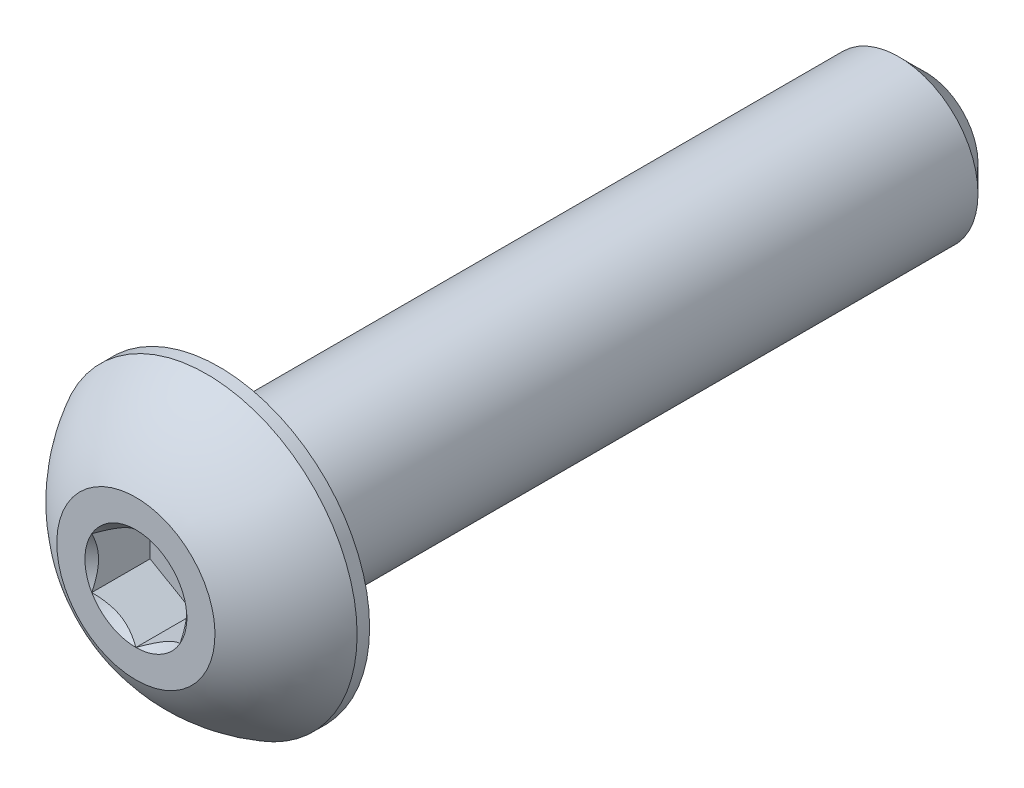
ISO-10303-21;
HEADER;
FILE_DESCRIPTION(('STEP AP214'),'2;1');
FILE_NAME('part.step','',(''),(''),'','','');
FILE_SCHEMA(('AUTOMOTIVE_DESIGN { 1 0 10303 214 1 1 1 1 }'));
ENDSEC;
DATA;
#1=APPLICATION_CONTEXT('core data for automotive mechanical design processes');
#2=APPLICATION_PROTOCOL_DEFINITION('international standard','automotive_design',2000,#1);
#3=PRODUCT_CONTEXT('',#1,'mechanical');
#4=PRODUCT('Part','Part','',(#3));
#5=PRODUCT_RELATED_PRODUCT_CATEGORY('part','',(#4));
#6=PRODUCT_DEFINITION_FORMATION('','',#4);
#7=PRODUCT_DEFINITION_CONTEXT('part definition',#1,'design');
#8=PRODUCT_DEFINITION('design','',#6,#7);
#9=PRODUCT_DEFINITION_SHAPE('','',#8);
#10=(LENGTH_UNIT() NAMED_UNIT(*) SI_UNIT(.MILLI.,.METRE.));
#11=(NAMED_UNIT(*) PLANE_ANGLE_UNIT() SI_UNIT($,.RADIAN.));
#12=(NAMED_UNIT(*) SI_UNIT($,.STERADIAN.) SOLID_ANGLE_UNIT());
#13=UNCERTAINTY_MEASURE_WITH_UNIT(LENGTH_MEASURE(1.E-05),#10,'distance_accuracy_value','');
#14=(GEOMETRIC_REPRESENTATION_CONTEXT(3) GLOBAL_UNCERTAINTY_ASSIGNED_CONTEXT((#13)) GLOBAL_UNIT_ASSIGNED_CONTEXT((#10,
#11,#12)) REPRESENTATION_CONTEXT('',''));
#15=CARTESIAN_POINT('',(0.,0.,0.));
#16=DIRECTION('',(0.,0.,1.));
#17=DIRECTION('',(1.,0.,0.));
#18=AXIS2_PLACEMENT_3D('',#15,#16,#17);
#19=CARTESIAN_POINT('',(0.,-1.4224,-14.1986));
#20=DIRECTION('',(0.,0.,-1.));
#21=DIRECTION('',(0.,1.,0.));
#22=AXIS2_PLACEMENT_3D('',#19,#20,#21);
#23=PLANE('',#22);
#24=CARTESIAN_POINT('',(0.,0.,-14.1986));
#25=DIRECTION('',(0.,0.,-1.));
#26=DIRECTION('',(0.,1.,0.));
#27=AXIS2_PLACEMENT_3D('',#24,#25,#26);
#28=CIRCLE('',#27,0.946150000000001);
#29=CARTESIAN_POINT('',(0.,-0.94615,-14.1986));
#30=VERTEX_POINT('',#29);
#31=EDGE_CURVE('E198',#30,#30,#28,.T.);
#32=ORIENTED_EDGE('',*,*,#31,.T.);
#33=EDGE_LOOP('',(#32));
#34=FACE_BOUND('',#33,.T.);
#35=ADVANCED_FACE('F39',(#34),#23,.T.);
#36=CARTESIAN_POINT('',(0.,0.,-14.1986));
#37=DIRECTION('',(0.,0.,-1.));
#38=DIRECTION('',(0.,1.,0.));
#39=AXIS2_PLACEMENT_3D('',#36,#37,#38);
#40=CYLINDRICAL_SURFACE('',#39,1.4224);
#41=CARTESIAN_POINT('',(0.,0.,-13.72235));
#42=DIRECTION('',(0.,0.,-1.));
#43=DIRECTION('',(0.,1.,0.));
#44=AXIS2_PLACEMENT_3D('',#41,#42,#43);
#45=CIRCLE('',#44,1.4224);
#46=CARTESIAN_POINT('',(0.,-1.4224,-13.72235));
#47=VERTEX_POINT('',#46);
#48=EDGE_CURVE('E54',#47,#47,#45,.F.);
#49=ORIENTED_EDGE('',*,*,#48,.T.);
#50=EDGE_LOOP('',(#49));
#51=FACE_BOUND('',#50,.T.);
#52=CARTESIAN_POINT('',(0.,0.,-1.4986));
#53=DIRECTION('',(0.,0.,1.));
#54=DIRECTION('',(1.,0.,0.));
#55=AXIS2_PLACEMENT_3D('',#52,#53,#54);
#56=CIRCLE('',#55,1.4224);
#57=CARTESIAN_POINT('',(1.4224,0.,-1.4986));
#58=VERTEX_POINT('',#57);
#59=EDGE_CURVE('E194',#58,#58,#56,.F.);
#60=ORIENTED_EDGE('',*,*,#59,.T.);
#61=EDGE_LOOP('',(#60));
#62=FACE_BOUND('',#61,.T.);
#63=ADVANCED_FACE('F206',(#51,#62),#40,.T.);
#64=CARTESIAN_POINT('',(0.,0.,-14.1986));
#65=DIRECTION('',(0.,0.,1.));
#66=DIRECTION('',(0.,-1.,0.));
#67=AXIS2_PLACEMENT_3D('',#64,#65,#66);
#68=CONICAL_SURFACE('',#67,0.946150000000001,0.785398163397447);
#69=CARTESIAN_POINT('',(0.,-1.4224,-13.72235));
#70=CARTESIAN_POINT('',(0.,-1.4174390625,-13.7273109375));
#71=CARTESIAN_POINT('',(0.,-1.412478125,-13.732271875));
#72=CARTESIAN_POINT('',(0.,-1.40255625,-13.74219375));
#73=CARTESIAN_POINT('',(0.,-1.3975953125,-13.7471546875));
#74=CARTESIAN_POINT('',(0.,-1.3876734375,-13.7570765625));
#75=CARTESIAN_POINT('',(0.,-1.3827125,-13.7620375));
#76=CARTESIAN_POINT('',(0.,-1.372790625,-13.771959375));
#77=CARTESIAN_POINT('',(0.,-1.3678296875,-13.7769203125));
#78=CARTESIAN_POINT('',(0.,-1.3579078125,-13.7868421875));
#79=CARTESIAN_POINT('',(0.,-1.352946875,-13.791803125));
#80=CARTESIAN_POINT('',(0.,-1.343025,-13.801725));
#81=CARTESIAN_POINT('',(0.,-1.3380640625,-13.8066859375));
#82=CARTESIAN_POINT('',(0.,-1.3281421875,-13.8166078125));
#83=CARTESIAN_POINT('',(0.,-1.32318125,-13.82156875));
#84=CARTESIAN_POINT('',(0.,-1.313259375,-13.831490625));
#85=CARTESIAN_POINT('',(0.,-1.3082984375,-13.8364515625));
#86=CARTESIAN_POINT('',(0.,-1.2983765625,-13.8463734375));
#87=CARTESIAN_POINT('',(0.,-1.293415625,-13.851334375));
#88=CARTESIAN_POINT('',(0.,-1.28349375,-13.86125625));
#89=CARTESIAN_POINT('',(0.,-1.2785328125,-13.8662171875));
#90=CARTESIAN_POINT('',(0.,-1.2686109375,-13.8761390625));
#91=CARTESIAN_POINT('',(0.,-1.26365,-13.8811));
#92=CARTESIAN_POINT('',(0.,-1.253728125,-13.891021875));
#93=CARTESIAN_POINT('',(0.,-1.2487671875,-13.8959828125));
#94=CARTESIAN_POINT('',(0.,-1.2388453125,-13.9059046875));
#95=CARTESIAN_POINT('',(0.,-1.233884375,-13.910865625));
#96=CARTESIAN_POINT('',(0.,-1.2239625,-13.9207875));
#97=CARTESIAN_POINT('',(0.,-1.2190015625,-13.9257484375));
#98=CARTESIAN_POINT('',(0.,-1.2090796875,-13.9356703125));
#99=CARTESIAN_POINT('',(0.,-1.20411875,-13.94063125));
#100=CARTESIAN_POINT('',(0.,-1.194196875,-13.950553125));
#101=CARTESIAN_POINT('',(0.,-1.1892359375,-13.9555140625));
#102=CARTESIAN_POINT('',(0.,-1.1793140625,-13.9654359375));
#103=CARTESIAN_POINT('',(0.,-1.174353125,-13.970396875));
#104=CARTESIAN_POINT('',(0.,-1.16443125,-13.98031875));
#105=CARTESIAN_POINT('',(0.,-1.1594703125,-13.9852796875));
#106=CARTESIAN_POINT('',(0.,-1.1495484375,-13.9952015625));
#107=CARTESIAN_POINT('',(0.,-1.1445875,-14.0001625));
#108=CARTESIAN_POINT('',(0.,-1.134665625,-14.010084375));
#109=CARTESIAN_POINT('',(0.,-1.1297046875,-14.0150453125));
#110=CARTESIAN_POINT('',(0.,-1.1197828125,-14.0249671875));
#111=CARTESIAN_POINT('',(0.,-1.114821875,-14.029928125));
#112=CARTESIAN_POINT('',(0.,-1.1049,-14.03985));
#113=CARTESIAN_POINT('',(0.,-1.0999390625,-14.0448109375));
#114=CARTESIAN_POINT('',(0.,-1.0900171875,-14.0547328125));
#115=CARTESIAN_POINT('',(0.,-1.08505625,-14.05969375));
#116=CARTESIAN_POINT('',(0.,-1.075134375,-14.069615625));
#117=CARTESIAN_POINT('',(0.,-1.0701734375,-14.0745765625));
#118=CARTESIAN_POINT('',(0.,-1.0602515625,-14.0844984375));
#119=CARTESIAN_POINT('',(0.,-1.055290625,-14.089459375));
#120=CARTESIAN_POINT('',(0.,-1.04536875,-14.09938125));
#121=CARTESIAN_POINT('',(0.,-1.0404078125,-14.1043421875));
#122=CARTESIAN_POINT('',(0.,-1.0304859375,-14.1142640625));
#123=CARTESIAN_POINT('',(0.,-1.025525,-14.119225));
#124=CARTESIAN_POINT('',(0.,-1.015603125,-14.129146875));
#125=CARTESIAN_POINT('',(0.,-1.0106421875,-14.1341078125));
#126=CARTESIAN_POINT('',(0.,-1.0007203125,-14.1440296875));
#127=CARTESIAN_POINT('',(0.,-0.995759375,-14.148990625));
#128=CARTESIAN_POINT('',(0.,-0.9858375,-14.1589125));
#129=CARTESIAN_POINT('',(0.,-0.9808765625,-14.1638734375));
#130=CARTESIAN_POINT('',(0.,-0.9709546875,-14.1737953125));
#131=CARTESIAN_POINT('',(0.,-0.96599375,-14.17875625));
#132=CARTESIAN_POINT('',(0.,-0.956071875,-14.188678125));
#133=CARTESIAN_POINT('',(0.,-0.9511109375,-14.1936390625));
#134=CARTESIAN_POINT('',(0.,-0.94615,-14.1986));
#135=B_SPLINE_CURVE_WITH_KNOTS('',3,(#69,#70,#71,#72,#73,#74,#75,#76,#77,#78,#79,#80,#81,#82,
#83,#84,#85,#86,#87,#88,#89,#90,#91,#92,#93,#94,#95,#96,#97,#98,#99,#100,#101,#102,#103,#104,
#105,#106,#107,#108,#109,#110,#111,#112,#113,#114,#115,#116,#117,#118,#119,#120,#121,#122,#123,
#124,#125,#126,#127,#128,#129,#130,#131,#132,#133,#134),.UNSPECIFIED.,.F.,.F.,(4,2,2,2,2,2,2,2,
2,2,2,2,2,2,2,2,2,2,2,2,2,2,2,2,2,2,2,2,2,2,2,2,4),(0.,0.0210474752837548,0.0420949505675108,
0.063142425851267,0.084189901135023,0.105237376418779,0.126284851702534,0.14733232698629,
0.168379802270046,0.189427277553802,0.210474752837558,0.231522228121313,0.252569703405069,
0.273617178688825,0.294664653972581,0.315712129256337,0.336759604540094,0.357807079823848,
0.378854555107605,0.399902030391361,0.420949505675117,0.441996980958873,0.463044456242628,
0.484091931526384,0.50513940681014,0.526186882093896,0.547234357377652,0.568281832661407,
0.589329307945163,0.610376783228919,0.631424258512675,0.652471733796431,0.673519209080186),.UNSPECIFIED.);
#136=EDGE_CURVE('BSEAM41',#47,#30,#135,.T.);
#137=ORIENTED_EDGE('',*,*,#48,.F.);
#138=ORIENTED_EDGE('',*,*,#31,.F.);
#139=ORIENTED_EDGE('',*,*,#136,.T.);
#140=ORIENTED_EDGE('',*,*,#136,.F.);
#141=EDGE_LOOP('',(#137,#139,#138,#140));
#142=FACE_BOUND('',#141,.T.);
#143=ADVANCED_FACE('F41',(#142),#68,.T.);
#144=CARTESIAN_POINT('',(0.,0.,-2.71505804087737));
#145=DIRECTION('',(0.,0.,1.));
#146=DIRECTION('',(0.,-1.,0.));
#147=AXIS2_PLACEMENT_3D('',#144,#145,#146);
#148=SPHERICAL_SURFACE('',#147,3.06508758852546);
#149=CARTESIAN_POINT('',(0.,0.,0.));
#150=DIRECTION('',(0.,0.,1.));
#151=DIRECTION('',(1.,0.,0.));
#152=AXIS2_PLACEMENT_3D('',#149,#150,#151);
#153=CIRCLE('',#152,1.4224);
#154=CARTESIAN_POINT('',(0.,-1.4224,0.));
#155=VERTEX_POINT('',#154);
#156=EDGE_CURVE('E190',#155,#155,#153,.T.);
#157=CARTESIAN_POINT('',(0.,0.,-1.27381));
#158=DIRECTION('',(0.,0.,1.));
#159=DIRECTION('',(1.,0.,0.));
#160=AXIS2_PLACEMENT_3D('',#157,#158,#159);
#161=CIRCLE('',#160,2.7051);
#162=CARTESIAN_POINT('',(0.,-2.7051,-1.27381));
#163=VERTEX_POINT('',#162);
#164=EDGE_CURVE('E182',#163,#163,#161,.T.);
#165=CARTESIAN_POINT('',(0.,-1.4224,0.));
#166=CARTESIAN_POINT('',(0.,-1.43933190212973,-0.00887048024317412));
#167=CARTESIAN_POINT('',(0.,-1.45618080460607,-0.0178993875420682));
#168=CARTESIAN_POINT('',(0.,-1.48970676037734,-0.036270809458289));
#169=CARTESIAN_POINT('',(0.,-1.50638381367226,-0.0456133240756156));
#170=CARTESIAN_POINT('',(0.,-1.53956022120603,-0.0646087138356938));
#171=CARTESIAN_POINT('',(0.,-1.55605957544488,-0.0742615889784453));
#172=CARTESIAN_POINT('',(0.,-1.58887481330553,-0.0938743149547814));
#173=CARTESIAN_POINT('',(0.,-1.60519069692734,-0.103834165788366));
#174=CARTESIAN_POINT('',(0.,-1.63763328189127,-0.124057358747556));
#175=CARTESIAN_POINT('',(0.,-1.6537599832334,-0.134320700873162));
#176=CARTESIAN_POINT('',(0.,-1.68581855934851,-0.155147283680413));
#177=CARTESIAN_POINT('',(0.,-1.70175043412149,-0.165710524362057));
#178=CARTESIAN_POINT('',(0.,-1.73341378069034,-0.187133207143222));
#179=CARTESIAN_POINT('',(0.,-1.74914525248621,-0.197992649242742));
#180=CARTESIAN_POINT('',(0.,-1.78040228691937,-0.220003933895924));
#181=CARTESIAN_POINT('',(0.,-1.79592784955665,-0.231155776449586));
#182=CARTESIAN_POINT('',(0.,-1.82676763153947,-0.253747958744367));
#183=CARTESIAN_POINT('',(0.,-1.84208185088501,-0.265188298485486));
#184=CARTESIAN_POINT('',(0.,-1.87249358612982,-0.288353470900217));
#185=CARTESIAN_POINT('',(0.,-1.88759110202907,-0.300078303573831));
#186=CARTESIAN_POINT('',(0.,-1.91756414607389,-0.323808358025657));
#187=CARTESIAN_POINT('',(0.,-1.93243967421946,-0.33581357980387));
#188=CARTESIAN_POINT('',(0.,-1.96196353614822,-0.360100210496753));
#189=CARTESIAN_POINT('',(0.,-1.97661186993141,-0.372381619411424));
#190=CARTESIAN_POINT('',(0.,-2.00567621604733,-0.397216325740561));
#191=CARTESIAN_POINT('',(0.,-2.02009222838005,-0.409769623155029));
#192=CARTESIAN_POINT('',(0.,-2.04868688582218,-0.435143712682892));
#193=CARTESIAN_POINT('',(0.,-2.06286553093158,-0.447964504796288));
#194=CARTESIAN_POINT('',(0.,-2.09098049123551,-0.473869096294883));
#195=CARTESIAN_POINT('',(0.,-2.10491680643004,-0.486952895680081));
#196=CARTESIAN_POINT('',(0.,-2.13254222903097,-0.51337892223953));
#197=CARTESIAN_POINT('',(0.,-2.14623133643737,-0.52672114941378));
#198=CARTESIAN_POINT('',(0.,-2.17335755211441,-0.553659361615835));
#199=CARTESIAN_POINT('',(0.,-2.18679466038506,-0.567255346643641));
#200=CARTESIAN_POINT('',(0.,-2.21341217464559,-0.594696315799095));
#201=CARTESIAN_POINT('',(0.,-2.22659258063549,-0.608541299926743));
#202=CARTESIAN_POINT('',(0.,-2.25269207703834,-0.636475421375575));
#203=CARTESIAN_POINT('',(0.,-2.2656111674513,-0.650564558696759));
#204=CARTESIAN_POINT('',(0.,-2.29118351086759,-0.678982055169879));
#205=CARTESIAN_POINT('',(0.,-2.30383676387093,-0.693310414321815));
#206=CARTESIAN_POINT('',(0.,-2.32887300368148,-0.722201339363229));
#207=CARTESIAN_POINT('',(0.,-2.34125599048871,-0.736763905252708));
#208=CARTESIAN_POINT('',(0.,-2.36574736371693,-0.766118146700866));
#209=CARTESIAN_POINT('',(0.,-2.37785575013793,-0.780909822259547));
#210=CARTESIAN_POINT('',(0.,-2.40179368451673,-0.810717105786825));
#211=CARTESIAN_POINT('',(0.,-2.41362323247454,-0.825732713755422));
#212=CARTESIAN_POINT('',(0.,-2.43699934944748,-0.855982606463854));
#213=CARTESIAN_POINT('',(0.,-2.44854591846261,-0.871216891203689));
#214=CARTESIAN_POINT('',(0.,-2.47135203611378,-0.901898805278105));
#215=CARTESIAN_POINT('',(0.,-2.48261158474981,-0.917346434612687));
#216=CARTESIAN_POINT('',(0.,-2.50483972067765,-0.948449631020968));
#217=CARTESIAN_POINT('',(0.,-2.51580830796946,-0.964105198094666));
#218=CARTESIAN_POINT('',(0.,-2.53745068204317,-0.995618790367452));
#219=CARTESIAN_POINT('',(0.,-2.54812446882507,-1.01147681556654));
#220=CARTESIAN_POINT('',(0.,-2.56917350604789,-1.04338977352953));
#221=CARTESIAN_POINT('',(0.,-2.57954875648881,-1.05944470629344));
#222=CARTESIAN_POINT('',(0.,-2.59999708912621,-1.09174586021953));
#223=CARTESIAN_POINT('',(0.,-2.61007017132268,-1.10799208138171));
#224=CARTESIAN_POINT('',(0.,-2.62991064343366,-1.14067012481285));
#225=CARTESIAN_POINT('',(0.,-2.63967803334818,-1.15710194708181));
#226=CARTESIAN_POINT('',(0.,-2.65890369600298,-1.19014544484563));
#227=CARTESIAN_POINT('',(0.,-2.66836196874327,-1.2067571203405));
#228=CARTESIAN_POINT('',(0.,-2.68696610965097,-1.24015449740349));
#229=CARTESIAN_POINT('',(0.,-2.69611197781837,-1.2569401989716));
#230=CARTESIAN_POINT('',(0.,-2.7051,-1.27381));
#231=B_SPLINE_CURVE_WITH_KNOTS('',3,(#165,#166,#167,#168,#169,#170,#171,#172,#173,#174,#175,
#176,#177,#178,#179,#180,#181,#182,#183,#184,#185,#186,#187,#188,#189,#190,#191,#192,#193,#194,
#195,#196,#197,#198,#199,#200,#201,#202,#203,#204,#205,#206,#207,#208,#209,#210,#211,#212,#213,
#214,#215,#216,#217,#218,#219,#220,#221,#222,#223,#224,#225,#226,#227,#228,#229,#230),
.UNSPECIFIED.,.F.,.F.,(4,2,2,2,2,2,2,2,2,2,2,2,2,2,2,2,2,2,2,2,2,2,2,2,2,2,2,2,2,2,2,2,4),(0.,
0.0573434957892615,0.114686991578524,0.172030487367785,0.229373983157046,0.286717478946308,
0.344060974735569,0.401404470524831,0.458747966314093,0.516091462103354,0.573434957892616,
0.630778453681877,0.688121949471139,0.7454654452604,0.802808941049662,0.860152436838924,
0.917495932628186,0.974839428417447,1.03218292420671,1.08952641999597,1.14686991578523,
1.20421341157449,1.26155690736375,1.31890040315302,1.37624389894228,1.43358739473154,
1.4909308905208,1.54827438631006,1.60561788209932,1.66296137788859,1.72030487367785,
1.77764836946711,1.83499186525637),.UNSPECIFIED.);
#232=EDGE_CURVE('BSEAM211',#155,#163,#231,.T.);
#233=ORIENTED_EDGE('',*,*,#156,.F.);
#234=ORIENTED_EDGE('',*,*,#164,.T.);
#235=ORIENTED_EDGE('',*,*,#232,.T.);
#236=ORIENTED_EDGE('',*,*,#232,.F.);
#237=EDGE_LOOP('',(#233,#235,#234,#236));
#238=FACE_BOUND('',#237,.T.);
#239=ADVANCED_FACE('F211',(#238),#148,.T.);
#240=CARTESIAN_POINT('',(0.,-1.4224,0.));
#241=DIRECTION('',(0.,0.,-1.));
#242=DIRECTION('',(-1.,0.,0.));
#243=AXIS2_PLACEMENT_3D('',#240,#241,#242);
#244=PLANE('',#243);
#245=CARTESIAN_POINT('',(0.,0.,0.));
#246=DIRECTION('',(0.,0.,1.));
#247=DIRECTION('',(1.,0.,0.));
#248=AXIS2_PLACEMENT_3D('',#245,#246,#247);
#249=CIRCLE('',#248,0.91654355233853);
#250=CARTESIAN_POINT('',(-0.793749999999999,0.458271776169265,0.));
#251=VERTEX_POINT('',#250);
#252=CARTESIAN_POINT('',(-0.793749999999999,-0.458271776169265,0.));
#253=VERTEX_POINT('',#252);
#254=EDGE_CURVE('E67',#251,#253,#249,.T.);
#255=ORIENTED_EDGE('',*,*,#254,.F.);
#256=CARTESIAN_POINT('',(0.,0.91654355233853,0.));
#257=VERTEX_POINT('',#256);
#258=EDGE_CURVE('E146',#257,#251,#249,.T.);
#259=ORIENTED_EDGE('',*,*,#258,.F.);
#260=CARTESIAN_POINT('',(0.79375,0.458271776169264,0.));
#261=VERTEX_POINT('',#260);
#262=EDGE_CURVE('E139',#261,#257,#249,.T.);
#263=ORIENTED_EDGE('',*,*,#262,.F.);
#264=CARTESIAN_POINT('',(0.79375,-0.458271776169264,0.));
#265=VERTEX_POINT('',#264);
#266=EDGE_CURVE('E108',#265,#261,#249,.T.);
#267=ORIENTED_EDGE('',*,*,#266,.F.);
#268=CARTESIAN_POINT('',(0.,-0.91654355233853,0.));
#269=VERTEX_POINT('',#268);
#270=EDGE_CURVE('E99',#269,#265,#249,.T.);
#271=ORIENTED_EDGE('',*,*,#270,.F.);
#272=EDGE_CURVE('E60',#253,#269,#249,.T.);
#273=ORIENTED_EDGE('',*,*,#272,.F.);
#274=EDGE_LOOP('',(#255,#259,#263,#267,#271,#273));
#275=FACE_BOUND('',#274,.T.);
#276=ORIENTED_EDGE('',*,*,#156,.T.);
#277=EDGE_LOOP('',(#276));
#278=FACE_BOUND('',#277,.T.);
#279=ADVANCED_FACE('F136',(#275,#278),#244,.F.);
#280=CARTESIAN_POINT('',(0.,-2.7051,-1.4986));
#281=DIRECTION('',(0.,0.,1.));
#282=DIRECTION('',(1.,0.,0.));
#283=AXIS2_PLACEMENT_3D('',#280,#281,#282);
#284=PLANE('',#283);
#285=ORIENTED_EDGE('',*,*,#59,.F.);
#286=EDGE_LOOP('',(#285));
#287=FACE_BOUND('',#286,.T.);
#288=CARTESIAN_POINT('',(0.,0.,-1.4986));
#289=DIRECTION('',(0.,0.,1.));
#290=DIRECTION('',(1.,0.,0.));
#291=AXIS2_PLACEMENT_3D('',#288,#289,#290);
#292=CIRCLE('',#291,2.7051);
#293=CARTESIAN_POINT('',(2.7051,0.,-1.4986));
#294=VERTEX_POINT('',#293);
#295=EDGE_CURVE('E186',#294,#294,#292,.T.);
#296=ORIENTED_EDGE('',*,*,#295,.F.);
#297=EDGE_LOOP('',(#296));
#298=FACE_BOUND('',#297,.T.);
#299=ADVANCED_FACE('F225',(#287,#298),#284,.F.);
#300=CARTESIAN_POINT('',(0.,0.,0.));
#301=DIRECTION('',(0.,0.,1.));
#302=DIRECTION('',(1.,0.,0.));
#303=AXIS2_PLACEMENT_3D('',#300,#301,#302);
#304=CYLINDRICAL_SURFACE('',#303,2.7051);
#305=ORIENTED_EDGE('',*,*,#164,.F.);
#306=EDGE_LOOP('',(#305));
#307=FACE_BOUND('',#306,.T.);
#308=ORIENTED_EDGE('',*,*,#295,.T.);
#309=EDGE_LOOP('',(#308));
#310=FACE_BOUND('',#309,.T.);
#311=ADVANCED_FACE('F228',(#307,#310),#304,.T.);
#312=CARTESIAN_POINT('',(0.,0.,0.));
#313=DIRECTION('',(0.,0.,1.));
#314=DIRECTION('',(1.,0.,0.));
#315=AXIS2_PLACEMENT_3D('',#312,#313,#314);
#316=CONICAL_SURFACE('',#315,0.91654355233853,0.78539816339745);
#317=ORIENTED_EDGE('',*,*,#266,.T.);
#318=CARTESIAN_POINT('',(0.79375,-0.913980968764267,0.293993631627029));
#319=CARTESIAN_POINT('',(0.79375,-0.891726118538055,0.277193311496454));
#320=CARTESIAN_POINT('',(0.79375,-0.869347264877752,0.260557718257382));
#321=CARTESIAN_POINT('',(0.79375,-0.824291243045378,0.227684030234418));
#322=CARTESIAN_POINT('',(0.79375,-0.801614001904386,0.211446035566629));
#323=CARTESIAN_POINT('',(0.79375,-0.732727209979177,0.163198806065011));
#324=CARTESIAN_POINT('',(0.79375,-0.686000956762751,0.131915081801585));
#325=CARTESIAN_POINT('',(0.79375,-0.588017825073374,0.0705014022532252));
#326=CARTESIAN_POINT('',(0.79375,-0.536654577597366,0.040539224828267));
#327=CARTESIAN_POINT('',(0.79375,-0.431362595405614,-0.0142679836015005));
#328=CARTESIAN_POINT('',(0.79375,-0.377443295160548,-0.0391302653555209));
#329=CARTESIAN_POINT('',(0.79375,-0.29650995625636,-0.0695469630114991));
#330=CARTESIAN_POINT('',(0.79375,-0.270694141900047,-0.0782767741549606));
#331=CARTESIAN_POINT('',(0.79375,-0.218439268973956,-0.0936638158775335));
#332=CARTESIAN_POINT('',(0.79375,-0.192000167603285,-0.100320903674906));
#333=CARTESIAN_POINT('',(0.79375,-0.139102716934156,-0.1111049811602));
#334=CARTESIAN_POINT('',(0.79375,-0.112653420679399,-0.115275685244172));
#335=CARTESIAN_POINT('',(0.79375,-0.0594633329666475,-0.121008229605795));
#336=CARTESIAN_POINT('',(0.79375,-0.0327224976765033,-0.122569671987743));
#337=CARTESIAN_POINT('',(0.79375,0.0198050550771914,-0.122965171893322));
#338=CARTESIAN_POINT('',(0.79375,0.0455910742996345,-0.121896431038318));
#339=CARTESIAN_POINT('',(0.79375,0.0969445862525452,-0.117304647495367));
#340=CARTESIAN_POINT('',(0.79375,0.122512036164618,-0.113781134579862));
#341=CARTESIAN_POINT('',(0.79375,0.173672423354303,-0.104412391955399));
#342=CARTESIAN_POINT('',(0.79375,0.199258034653238,-0.0985277583090937));
#343=CARTESIAN_POINT('',(0.79375,0.249870222697891,-0.084749526681036));
#344=CARTESIAN_POINT('',(0.79375,0.274896846029654,-0.0768560967969795));
#345=CARTESIAN_POINT('',(0.79375,0.353690387196626,-0.0490351109532734));
#346=CARTESIAN_POINT('',(0.79375,0.406335817043669,-0.0259390687874084));
#347=CARTESIAN_POINT('',(0.79375,0.50915351257115,0.0254121679018188));
#348=CARTESIAN_POINT('',(0.79375,0.559316042936871,0.0536858976787298));
#349=CARTESIAN_POINT('',(0.79375,0.655183863923379,0.112017096551381));
#350=CARTESIAN_POINT('',(0.79375,0.700986777162507,0.141916107892194));
#351=CARTESIAN_POINT('',(0.79375,0.768468152386361,0.188136889360364));
#352=CARTESIAN_POINT('',(0.79375,0.790670702494181,0.203706789966175));
#353=CARTESIAN_POINT('',(0.79375,0.834772410478896,0.235258385232157));
#354=CARTESIAN_POINT('',(0.79375,0.856671649663555,0.251239966115284));
#355=CARTESIAN_POINT('',(0.79375,0.878444595919578,0.267392244316132));
#356=B_SPLINE_CURVE_WITH_KNOTS('',3,(#318,#319,#320,#321,#322,#323,#324,#325,#326,#327,#328,
#329,#330,#331,#332,#333,#334,#335,#336,#337,#338,#339,#340,#341,#342,#343,#344,#345,#346,#347,
#348,#349,#350,#351,#352,#353,#354,#355),.UNSPECIFIED.,.F.,.F.,(4,2,2,2,2,2,2,2,2,2,2,2,2,2,2,2,
2,2,4),(0.,0.0836505019132838,0.167321854975135,0.335941679244387,0.514186123196809,
0.691817321841748,0.773503877759004,0.855196059496702,0.935406023972398,1.01562821883824,
1.09293052036567,1.17024763372476,1.24891262607845,1.32757103784517,1.49953149859788,
1.67212003005563,1.83613214173928,1.91748242813391,1.99881046779771),.UNSPECIFIED.);
#357=EDGE_CURVE('E11',#265,#261,#356,.T.);
#358=ORIENTED_EDGE('',*,*,#357,.F.);
#359=EDGE_LOOP('',(#317,#358));
#360=FACE_BOUND('',#359,.T.);
#361=ADVANCED_FACE('F112',(#360),#316,.F.);
#362=ORIENTED_EDGE('',*,*,#262,.T.);
#363=CARTESIAN_POINT('',(0.79395,0.458156306115427,0.000115491872201689));
#364=CARTESIAN_POINT('',(0.7666563268291,0.473914315667819,-0.0156332211800419));
#365=CARTESIAN_POINT('',(0.738906237701709,0.489935837095555,-0.0304574524158215));
#366=CARTESIAN_POINT('',(0.68232025046316,0.522605772060092,-0.0576009622140622));
#367=CARTESIAN_POINT('',(0.653478963353311,0.539257296936738,-0.0699051262716212));
#368=CARTESIAN_POINT('',(0.595321679020445,0.572834420701656,-0.0909826334294039));
#369=CARTESIAN_POINT('',(0.56602051479722,0.589751455753505,-0.0998089918524525));
#370=CARTESIAN_POINT('',(0.506773157113023,0.62395793366125,-0.113408761275761));
#371=CARTESIAN_POINT('',(0.476828775638362,0.641246330366362,-0.118192331870017));
#372=CARTESIAN_POINT('',(0.425225377533547,0.671039566153276,-0.122506590544054));
#373=CARTESIAN_POINT('',(0.403633531741488,0.683505624133623,-0.123144728589032));
#374=CARTESIAN_POINT('',(0.360491632722968,0.708413611145317,-0.122073860208805));
#375=CARTESIAN_POINT('',(0.338941589763515,0.720855534249005,-0.12036433611821));
#376=CARTESIAN_POINT('',(0.274599154455217,0.758003656594567,-0.111827208841405));
#377=CARTESIAN_POINT('',(0.232126946019304,0.782524997568119,-0.101590080863207));
#378=CARTESIAN_POINT('',(0.157575609219718,0.825567231937807,-0.0768814101594512));
#379=CARTESIAN_POINT('',(0.125147212182332,0.844289775696729,-0.0637038253246891));
#380=CARTESIAN_POINT('',(0.0615608535385163,0.881001376976525,-0.0340189600483212));
#381=CARTESIAN_POINT('',(0.0303991453684829,0.898992597576902,-0.0175225121068322));
#382=CARTESIAN_POINT('',(-0.000199999999999989,0.916659022392368,0.000115491872201412));
#383=B_SPLINE_CURVE_WITH_KNOTS('',3,(#363,#364,#365,#366,#367,#368,#369,#370,#371,#372,#373,
#374,#375,#376,#377,#378,#379,#380,#381,#382),.UNSPECIFIED.,.F.,.F.,(4,2,2,2,2,2,2,2,2,4),(0.,
0.105768699105622,0.21215429718622,0.316848842533859,0.421279499712346,0.495991864977074,
0.570720707151283,0.720221070373884,0.839150369964801,0.957697614118391),.UNSPECIFIED.);
#384=EDGE_CURVE('E145',#261,#257,#383,.T.);
#385=ORIENTED_EDGE('',*,*,#384,.F.);
#386=EDGE_LOOP('',(#362,#385));
#387=FACE_BOUND('',#386,.T.);
#388=ADVANCED_FACE('F319',(#387),#316,.F.);
#389=ORIENTED_EDGE('',*,*,#258,.T.);
#390=CARTESIAN_POINT('',(0.000200000000000011,0.916659022392368,0.000115491872201451));
#391=CARTESIAN_POINT('',(-0.0270936731708998,0.900901012839975,-0.0156332211800421));
#392=CARTESIAN_POINT('',(-0.0548437622982912,0.88487949141224,-0.0304574524158218));
#393=CARTESIAN_POINT('',(-0.11142974953684,0.852209556447703,-0.0576009622140624));
#394=CARTESIAN_POINT('',(-0.140271036646688,0.835558031571057,-0.0699051262716215));
#395=CARTESIAN_POINT('',(-0.198428320979555,0.801980907806138,-0.0909826334294042));
#396=CARTESIAN_POINT('',(-0.22772948520278,0.78506387275429,-0.0998089918524528));
#397=CARTESIAN_POINT('',(-0.286976842886977,0.750857394846545,-0.113408761275762));
#398=CARTESIAN_POINT('',(-0.316921224361638,0.733568998141433,-0.118192331870018));
#399=CARTESIAN_POINT('',(-0.368524622466452,0.703775762354518,-0.122506590544054));
#400=CARTESIAN_POINT('',(-0.390116468258512,0.691309704374172,-0.123144728589032));
#401=CARTESIAN_POINT('',(-0.433258367277032,0.666401717362478,-0.122073860208806));
#402=CARTESIAN_POINT('',(-0.454808410236485,0.65395979425879,-0.12036433611821));
#403=CARTESIAN_POINT('',(-0.519150845544783,0.616811671913227,-0.111827208841406));
#404=CARTESIAN_POINT('',(-0.561623053980695,0.592290330939676,-0.101590080863207));
#405=CARTESIAN_POINT('',(-0.636174390780282,0.549248096569988,-0.0768814101594513));
#406=CARTESIAN_POINT('',(-0.668602787817667,0.530525552811065,-0.0637038253246893));
#407=CARTESIAN_POINT('',(-0.732189146461483,0.49381395153127,-0.0340189600483213));
#408=CARTESIAN_POINT('',(-0.763350854631516,0.475822730930893,-0.0175225121068323));
#409=CARTESIAN_POINT('',(-0.793949999999999,0.458156306115427,0.000115491872201152));
#410=B_SPLINE_CURVE_WITH_KNOTS('',3,(#390,#391,#392,#393,#394,#395,#396,#397,#398,#399,#400,
#401,#402,#403,#404,#405,#406,#407,#408,#409),.UNSPECIFIED.,.F.,.F.,(4,2,2,2,2,2,2,2,2,4),(0.,
0.105768699105622,0.21215429718622,0.316848842533859,0.421279499712346,0.495991864977074,
0.570720707151284,0.720221070373884,0.839150369964801,0.957697614118391),.UNSPECIFIED.);
#411=EDGE_CURVE('E153',#257,#251,#410,.T.);
#412=ORIENTED_EDGE('',*,*,#411,.F.);
#413=EDGE_LOOP('',(#389,#412));
#414=FACE_BOUND('',#413,.T.);
#415=ADVANCED_FACE('F156',(#414),#316,.F.);
#416=ORIENTED_EDGE('',*,*,#254,.T.);
#417=CARTESIAN_POINT('',(-0.793749999999999,-0.913980968631288,0.293993631526626));
#418=CARTESIAN_POINT('',(-0.793749999999999,-0.891726118408807,0.277193311399918));
#419=CARTESIAN_POINT('',(-0.793749999999999,-0.869347264752246,0.260557718164707));
#420=CARTESIAN_POINT('',(-0.793749999999999,-0.824291242927396,0.227684030149443));
#421=CARTESIAN_POINT('',(-0.793749999999999,-0.801614001790185,0.211446035485493));
#422=CARTESIAN_POINT('',(-0.793749999999999,-0.732727209876546,0.163198805995464));
#423=CARTESIAN_POINT('',(-0.793749999999999,-0.686000956667989,0.131915081739731));
#424=CARTESIAN_POINT('',(-0.793749999999999,-0.588017824995773,0.0705014022071964));
#425=CARTESIAN_POINT('',(-0.793749999999999,-0.536654577529102,0.0405392247903116));
#426=CARTESIAN_POINT('',(-0.793749999999999,-0.43136259535682,-0.0142679836244891));
#427=CARTESIAN_POINT('',(-0.793749999999999,-0.37744329512188,-0.0391302653716058));
#428=CARTESIAN_POINT('',(-0.793749999999999,-0.296509956225309,-0.0695469630224598));
#429=CARTESIAN_POINT('',(-0.793749999999999,-0.270694141865806,-0.0782767741661214));
#430=CARTESIAN_POINT('',(-0.793749999999999,-0.21843926893323,-0.0936638158884484));
#431=CARTESIAN_POINT('',(-0.793749999999999,-0.192000167559264,-0.100320903685375));
#432=CARTESIAN_POINT('',(-0.793749999999999,-0.139102716883655,-0.111104981169031));
#433=CARTESIAN_POINT('',(-0.793749999999999,-0.112653420625716,-0.11527568525183));
#434=CARTESIAN_POINT('',(-0.793749999999999,-0.0594633329067019,-0.121008229610386));
#435=CARTESIAN_POINT('',(-0.793749999999999,-0.0327224976134788,-0.122569671990441));
#436=CARTESIAN_POINT('',(-0.793749999999999,0.0198050551458938,-0.122965171891697));
#437=CARTESIAN_POINT('',(-0.793749999999999,0.0455910743709441,-0.1218964310343));
#438=CARTESIAN_POINT('',(-0.793749999999999,0.0969445863288114,-0.117304647486189));
#439=CARTESIAN_POINT('',(-0.793749999999999,0.122512036243234,-0.113781134567918));
#440=CARTESIAN_POINT('',(-0.793749999999999,0.173672423437555,-0.104412391937657));
#441=CARTESIAN_POINT('',(-0.793749999999999,0.19925803473877,-0.0985277582883018));
#442=CARTESIAN_POINT('',(-0.793749999999999,0.249870222787763,-0.0847495266540782));
#443=CARTESIAN_POINT('',(-0.793749999999999,0.274896846121587,-0.0768560967669054));
#444=CARTESIAN_POINT('',(-0.79375,0.353690387308577,-0.0490351109085087));
#445=CARTESIAN_POINT('',(-0.793749999999999,0.406335817172575,-0.0259390687291273));
#446=CARTESIAN_POINT('',(-0.793749999999999,0.509153512732664,0.0254121679886215));
#447=CARTESIAN_POINT('',(-0.793749999999999,0.559316043114031,0.0536858977805485));
#448=CARTESIAN_POINT('',(-0.793749999999999,0.655183864128666,0.112017096681941));
#449=CARTESIAN_POINT('',(-0.79375,0.700986777380378,0.141916108036348));
#450=CARTESIAN_POINT('',(-0.79375,0.768468152622838,0.188136889524838));
#451=CARTESIAN_POINT('',(-0.79375,0.790670702736771,0.203706790137368));
#452=CARTESIAN_POINT('',(-0.79375,0.834772410733671,0.235258385416782));
#453=CARTESIAN_POINT('',(-0.79375,0.856671649924403,0.251239966306619));
#454=CARTESIAN_POINT('',(-0.79375,0.878444596186488,0.26739224451417));
#455=B_SPLINE_CURVE_WITH_KNOTS('',3,(#417,#418,#419,#420,#421,#422,#423,#424,#425,#426,#427,
#428,#429,#430,#431,#432,#433,#434,#435,#436,#437,#438,#439,#440,#441,#442,#443,#444,#445,#446,
#447,#448,#449,#450,#451,#452,#453,#454),.UNSPECIFIED.,.F.,.F.,(4,2,2,2,2,2,2,2,2,2,2,2,2,2,2,2,
2,2,4),(0.,0.0836505018973617,0.167321854943286,0.33594167918009,0.514186123096124,
0.69181732170502,0.773503877631502,0.855196059378408,0.935406023862935,1.01562821873761,
1.09293052027313,1.17024763364031,1.24891262600271,1.32757103777814,1.49953149859345,
1.67212003011421,1.83613214185176,1.91748242827298,1.99881046796337),.UNSPECIFIED.);
#456=EDGE_CURVE('E160',#251,#253,#455,.F.);
#457=ORIENTED_EDGE('',*,*,#456,.F.);
#458=EDGE_LOOP('',(#416,#457));
#459=FACE_BOUND('',#458,.T.);
#460=ADVANCED_FACE('F313',(#459),#316,.F.);
#461=ORIENTED_EDGE('',*,*,#272,.T.);
#462=CARTESIAN_POINT('',(-0.793949999999999,-0.458156306115427,0.000115491872201147));
#463=CARTESIAN_POINT('',(-0.766656326829099,-0.47391431566782,-0.0156332211800423));
#464=CARTESIAN_POINT('',(-0.738906237701708,-0.489935837095555,-0.030457452415822));
#465=CARTESIAN_POINT('',(-0.682320250463159,-0.522605772060092,-0.0576009622140626));
#466=CARTESIAN_POINT('',(-0.653478963353311,-0.539257296936738,-0.0699051262716217));
#467=CARTESIAN_POINT('',(-0.595321679020444,-0.572834420701656,-0.0909826334294043));
#468=CARTESIAN_POINT('',(-0.566020514797219,-0.589751455753505,-0.0998089918524529));
#469=CARTESIAN_POINT('',(-0.506773157113023,-0.62395793366125,-0.113408761275762));
#470=CARTESIAN_POINT('',(-0.476828775638362,-0.641246330366362,-0.118192331870018));
#471=CARTESIAN_POINT('',(-0.425225377533547,-0.671039566153276,-0.122506590544054));
#472=CARTESIAN_POINT('',(-0.403633531741488,-0.683505624133623,-0.123144728589032));
#473=CARTESIAN_POINT('',(-0.360491632722968,-0.708413611145317,-0.122073860208806));
#474=CARTESIAN_POINT('',(-0.338941589763515,-0.720855534249005,-0.12036433611821));
#475=CARTESIAN_POINT('',(-0.274599154455216,-0.758003656594567,-0.111827208841406));
#476=CARTESIAN_POINT('',(-0.232126946019304,-0.782524997568119,-0.101590080863207));
#477=CARTESIAN_POINT('',(-0.157575609219718,-0.825567231937806,-0.0768814101594515));
#478=CARTESIAN_POINT('',(-0.125147212182332,-0.844289775696729,-0.0637038253246894));
#479=CARTESIAN_POINT('',(-0.0615608535385159,-0.881001376976524,-0.0340189600483214));
#480=CARTESIAN_POINT('',(-0.0303991453684823,-0.898992597576902,-0.0175225121068323));
#481=CARTESIAN_POINT('',(0.000200000000000646,-0.916659022392368,0.000115491872201307));
#482=B_SPLINE_CURVE_WITH_KNOTS('',3,(#462,#463,#464,#465,#466,#467,#468,#469,#470,#471,#472,
#473,#474,#475,#476,#477,#478,#479,#480,#481),.UNSPECIFIED.,.F.,.F.,(4,2,2,2,2,2,2,2,2,4),(0.,
0.105768699105621,0.21215429718622,0.316848842533859,0.421279499712346,0.495991864977073,
0.570720707151283,0.720221070373883,0.839150369964801,0.957697614118391),.UNSPECIFIED.);
#483=EDGE_CURVE('E125',#253,#269,#482,.T.);
#484=ORIENTED_EDGE('',*,*,#483,.F.);
#485=EDGE_LOOP('',(#461,#484));
#486=FACE_BOUND('',#485,.T.);
#487=ADVANCED_FACE('F255',(#486),#316,.F.);
#488=ORIENTED_EDGE('',*,*,#270,.T.);
#489=CARTESIAN_POINT('',(-0.000199999999999339,-0.916659022392368,0.000115491872201342));
#490=CARTESIAN_POINT('',(0.0270936731709004,-0.900901012839975,-0.015633221180042));
#491=CARTESIAN_POINT('',(0.0548437622982917,-0.88487949141224,-0.0304574524158217));
#492=CARTESIAN_POINT('',(0.11142974953684,-0.852209556447703,-0.0576009622140623));
#493=CARTESIAN_POINT('',(0.140271036646689,-0.835558031571057,-0.0699051262716213));
#494=CARTESIAN_POINT('',(0.198428320979555,-0.801980907806139,-0.090982633429404));
#495=CARTESIAN_POINT('',(0.22772948520278,-0.78506387275429,-0.0998089918524525));
#496=CARTESIAN_POINT('',(0.286976842886977,-0.750857394846545,-0.113408761275761));
#497=CARTESIAN_POINT('',(0.316921224361638,-0.733568998141433,-0.118192331870017));
#498=CARTESIAN_POINT('',(0.368524622466452,-0.703775762354519,-0.122506590544054));
#499=CARTESIAN_POINT('',(0.390116468258512,-0.691309704374172,-0.123144728589031));
#500=CARTESIAN_POINT('',(0.433258367277032,-0.666401717362478,-0.122073860208805));
#501=CARTESIAN_POINT('',(0.454808410236485,-0.65395979425879,-0.120364336118209));
#502=CARTESIAN_POINT('',(0.519150845544783,-0.616811671913228,-0.111827208841405));
#503=CARTESIAN_POINT('',(0.561623053980696,-0.592290330939676,-0.101590080863206));
#504=CARTESIAN_POINT('',(0.636174390780282,-0.549248096569989,-0.0768814101594509));
#505=CARTESIAN_POINT('',(0.668602787817667,-0.530525552811066,-0.0637038253246888));
#506=CARTESIAN_POINT('',(0.732189146461484,-0.493813951531271,-0.0340189600483207));
#507=CARTESIAN_POINT('',(0.763350854631517,-0.475822730930893,-0.0175225121068317));
#508=CARTESIAN_POINT('',(0.79395,-0.458156306115427,0.000115491872201898));
#509=B_SPLINE_CURVE_WITH_KNOTS('',3,(#489,#490,#491,#492,#493,#494,#495,#496,#497,#498,#499,
#500,#501,#502,#503,#504,#505,#506,#507,#508),.UNSPECIFIED.,.F.,.F.,(4,2,2,2,2,2,2,2,2,4),(0.,
0.105768699105621,0.21215429718622,0.316848842533858,0.421279499712345,0.495991864977073,
0.570720707151283,0.720221070373883,0.839150369964801,0.95769761411839),.UNSPECIFIED.);
#510=EDGE_CURVE('E103',#269,#265,#509,.T.);
#511=ORIENTED_EDGE('',*,*,#510,.F.);
#512=EDGE_LOOP('',(#488,#511));
#513=FACE_BOUND('',#512,.T.);
#514=ADVANCED_FACE('F101',(#513),#316,.F.);
#515=CARTESIAN_POINT('',(0.79375,-0.458271776169265,-1.04902));
#516=DIRECTION('',(0.,0.,1.));
#517=DIRECTION('',(1.,0.,0.));
#518=AXIS2_PLACEMENT_3D('',#515,#516,#517);
#519=PLANE('',#518);
#520=DIRECTION('',(0.866025403784439,0.5,0.));
#521=VECTOR('',#520,1.);
#522=CARTESIAN_POINT('',(0.,-0.91654355233853,-1.04902));
#523=LINE('',#522,#521);
#524=CARTESIAN_POINT('',(0.,-0.91654355233853,-1.04902));
#525=VERTEX_POINT('',#524);
#526=CARTESIAN_POINT('',(0.79375,-0.458271776169265,-1.04902));
#527=VERTEX_POINT('',#526);
#528=EDGE_CURVE('E124',#525,#527,#523,.T.);
#529=ORIENTED_EDGE('',*,*,#528,.T.);
#530=DIRECTION('',(0.,1.,0.));
#531=VECTOR('',#530,1.);
#532=CARTESIAN_POINT('',(0.79375,-0.458271776169265,-1.04902));
#533=LINE('',#532,#531);
#534=CARTESIAN_POINT('',(0.79375,0.458271776169265,-1.04902));
#535=VERTEX_POINT('',#534);
#536=EDGE_CURVE('E129',#527,#535,#533,.T.);
#537=ORIENTED_EDGE('',*,*,#536,.T.);
#538=DIRECTION('',(-0.866025403784439,0.5,0.));
#539=VECTOR('',#538,1.);
#540=CARTESIAN_POINT('',(0.79375,0.458271776169265,-1.04902));
#541=LINE('',#540,#539);
#542=CARTESIAN_POINT('',(0.,0.91654355233853,-1.04902));
#543=VERTEX_POINT('',#542);
#544=EDGE_CURVE('E300',#535,#543,#541,.T.);
#545=ORIENTED_EDGE('',*,*,#544,.T.);
#546=DIRECTION('',(-0.866025403784438,-0.5,0.));
#547=VECTOR('',#546,1.);
#548=CARTESIAN_POINT('',(0.,0.91654355233853,-1.04902));
#549=LINE('',#548,#547);
#550=CARTESIAN_POINT('',(-0.793749999999999,0.458271776169265,-1.04902));
#551=VERTEX_POINT('',#550);
#552=EDGE_CURVE('E169',#543,#551,#549,.T.);
#553=ORIENTED_EDGE('',*,*,#552,.T.);
#554=DIRECTION('',(0.,-1.,0.));
#555=VECTOR('',#554,1.);
#556=CARTESIAN_POINT('',(-0.793749999999999,0.458271776169265,-1.04902));
#557=LINE('',#556,#555);
#558=CARTESIAN_POINT('',(-0.793749999999999,-0.458271776169265,-1.04902));
#559=VERTEX_POINT('',#558);
#560=EDGE_CURVE('E306',#551,#559,#557,.T.);
#561=ORIENTED_EDGE('',*,*,#560,.T.);
#562=DIRECTION('',(0.866025403784439,-0.5,0.));
#563=VECTOR('',#562,1.);
#564=CARTESIAN_POINT('',(-0.793749999999999,-0.458271776169265,-1.04902));
#565=LINE('',#564,#563);
#566=EDGE_CURVE('E133',#559,#525,#565,.T.);
#567=ORIENTED_EDGE('',*,*,#566,.T.);
#568=EDGE_LOOP('',(#529,#537,#545,#553,#561,#567));
#569=FACE_BOUND('',#568,.T.);
#570=ADVANCED_FACE('F254',(#569),#519,.T.);
#571=CARTESIAN_POINT('',(0.79375,-0.458271776169265,-1.04902));
#572=DIRECTION('',(1.,0.,0.));
#573=DIRECTION('',(0.,1.,0.));
#574=AXIS2_PLACEMENT_3D('',#571,#572,#573);
#575=PLANE('',#574);
#576=DIRECTION('',(0.,0.,1.));
#577=VECTOR('',#576,1.);
#578=CARTESIAN_POINT('',(0.79375,-0.458271776169265,-1.04902));
#579=LINE('',#578,#577);
#580=EDGE_CURVE('E120',#527,#265,#579,.T.);
#581=ORIENTED_EDGE('',*,*,#580,.T.);
#582=ORIENTED_EDGE('',*,*,#357,.T.);
#583=DIRECTION('',(0.,0.,1.));
#584=VECTOR('',#583,1.);
#585=CARTESIAN_POINT('',(0.79375,0.458271776169265,-1.04902));
#586=LINE('',#585,#584);
#587=EDGE_CURVE('E132',#535,#261,#586,.T.);
#588=ORIENTED_EDGE('',*,*,#587,.F.);
#589=ORIENTED_EDGE('',*,*,#536,.F.);
#590=EDGE_LOOP('',(#581,#582,#588,#589));
#591=FACE_BOUND('',#590,.T.);
#592=ADVANCED_FACE('F127',(#591),#575,.F.);
#593=CARTESIAN_POINT('',(0.79375,0.458271776169265,-1.04902));
#594=DIRECTION('',(0.5,0.866025403784439,0.));
#595=DIRECTION('',(-0.866025403784439,0.5,0.));
#596=AXIS2_PLACEMENT_3D('',#593,#594,#595);
#597=PLANE('',#596);
#598=ORIENTED_EDGE('',*,*,#587,.T.);
#599=ORIENTED_EDGE('',*,*,#384,.T.);
#600=DIRECTION('',(0.,0.,1.));
#601=VECTOR('',#600,1.);
#602=CARTESIAN_POINT('',(0.,0.91654355233853,-1.04902));
#603=LINE('',#602,#601);
#604=EDGE_CURVE('E165',#543,#257,#603,.T.);
#605=ORIENTED_EDGE('',*,*,#604,.F.);
#606=ORIENTED_EDGE('',*,*,#544,.F.);
#607=EDGE_LOOP('',(#598,#599,#605,#606));
#608=FACE_BOUND('',#607,.T.);
#609=ADVANCED_FACE('F163',(#608),#597,.F.);
#610=CARTESIAN_POINT('',(0.,0.91654355233853,-1.04902));
#611=DIRECTION('',(-0.5,0.866025403784438,0.));
#612=DIRECTION('',(-0.866025403784438,-0.5,0.));
#613=AXIS2_PLACEMENT_3D('',#610,#611,#612);
#614=PLANE('',#613);
#615=ORIENTED_EDGE('',*,*,#604,.T.);
#616=ORIENTED_EDGE('',*,*,#411,.T.);
#617=DIRECTION('',(0.,0.,1.));
#618=VECTOR('',#617,1.);
#619=CARTESIAN_POINT('',(-0.793749999999999,0.458271776169265,-1.04902));
#620=LINE('',#619,#618);
#621=EDGE_CURVE('E172',#551,#251,#620,.T.);
#622=ORIENTED_EDGE('',*,*,#621,.F.);
#623=ORIENTED_EDGE('',*,*,#552,.F.);
#624=EDGE_LOOP('',(#615,#616,#622,#623));
#625=FACE_BOUND('',#624,.T.);
#626=ADVANCED_FACE('F167',(#625),#614,.F.);
#627=CARTESIAN_POINT('',(-0.793749999999999,0.458271776169265,-1.04902));
#628=DIRECTION('',(-1.,0.,0.));
#629=DIRECTION('',(0.,-1.,0.));
#630=AXIS2_PLACEMENT_3D('',#627,#628,#629);
#631=PLANE('',#630);
#632=ORIENTED_EDGE('',*,*,#621,.T.);
#633=ORIENTED_EDGE('',*,*,#456,.T.);
#634=DIRECTION('',(0.,0.,1.));
#635=VECTOR('',#634,1.);
#636=CARTESIAN_POINT('',(-0.793749999999999,-0.458271776169265,-1.04902));
#637=LINE('',#636,#635);
#638=EDGE_CURVE('E176',#559,#253,#637,.T.);
#639=ORIENTED_EDGE('',*,*,#638,.F.);
#640=ORIENTED_EDGE('',*,*,#560,.F.);
#641=EDGE_LOOP('',(#632,#633,#639,#640));
#642=FACE_BOUND('',#641,.T.);
#643=ADVANCED_FACE('F276',(#642),#631,.F.);
#644=CARTESIAN_POINT('',(-0.793749999999999,-0.458271776169265,-1.04902));
#645=DIRECTION('',(-0.5,-0.866025403784439,0.));
#646=DIRECTION('',(0.866025403784439,-0.5,0.));
#647=AXIS2_PLACEMENT_3D('',#644,#645,#646);
#648=PLANE('',#647);
#649=ORIENTED_EDGE('',*,*,#638,.T.);
#650=ORIENTED_EDGE('',*,*,#483,.T.);
#651=DIRECTION('',(0.,0.,1.));
#652=VECTOR('',#651,1.);
#653=CARTESIAN_POINT('',(0.,-0.91654355233853,-1.04902));
#654=LINE('',#653,#652);
#655=EDGE_CURVE('E122',#525,#269,#654,.T.);
#656=ORIENTED_EDGE('',*,*,#655,.F.);
#657=ORIENTED_EDGE('',*,*,#566,.F.);
#658=EDGE_LOOP('',(#649,#650,#656,#657));
#659=FACE_BOUND('',#658,.T.);
#660=ADVANCED_FACE('F235',(#659),#648,.F.);
#661=CARTESIAN_POINT('',(0.,-0.91654355233853,-1.04902));
#662=DIRECTION('',(0.5,-0.866025403784439,0.));
#663=DIRECTION('',(0.866025403784439,0.5,0.));
#664=AXIS2_PLACEMENT_3D('',#661,#662,#663);
#665=PLANE('',#664);
#666=ORIENTED_EDGE('',*,*,#655,.T.);
#667=ORIENTED_EDGE('',*,*,#510,.T.);
#668=ORIENTED_EDGE('',*,*,#580,.F.);
#669=ORIENTED_EDGE('',*,*,#528,.F.);
#670=EDGE_LOOP('',(#666,#667,#668,#669));
#671=FACE_BOUND('',#670,.T.);
#672=ADVANCED_FACE('F118',(#671),#665,.F.);
#673=CLOSED_SHELL('',(#35,#63,#143,#239,#279,#299,#311,#361,#388,#415,#460,#487,#514,#570,#592,
#609,#626,#643,#660,#672));
#674=MANIFOLD_SOLID_BREP('B2',#673);
#675=ADVANCED_BREP_SHAPE_REPRESENTATION('',(#18,#674),#14);
#676=SHAPE_DEFINITION_REPRESENTATION(#9,#675);
ENDSEC;
END-ISO-10303-21;
